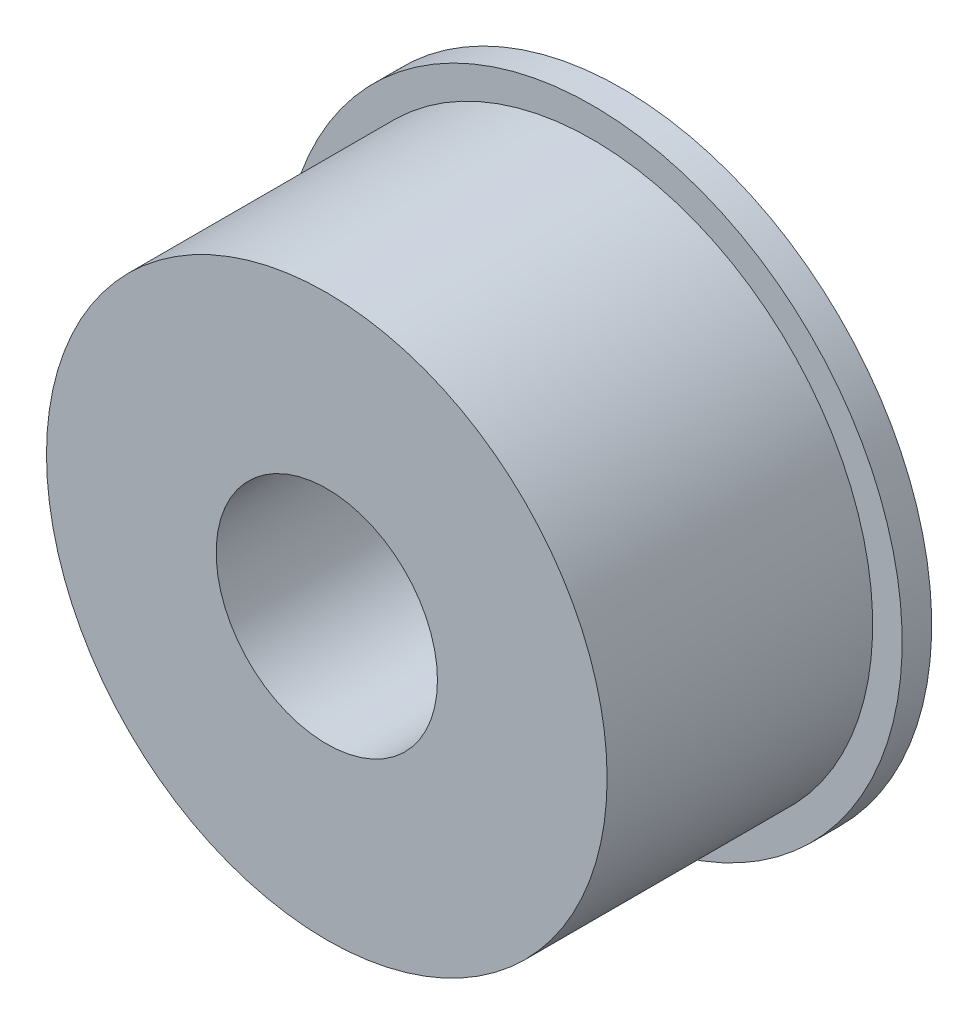
ISO-10303-21;
HEADER;
FILE_DESCRIPTION(('STEP AP214'),'2;1');
FILE_NAME('part.step','',(''),(''),'','','');
FILE_SCHEMA(('AUTOMOTIVE_DESIGN { 1 0 10303 214 1 1 1 1 }'));
ENDSEC;
DATA;
#1=APPLICATION_CONTEXT('core data for automotive mechanical design processes');
#2=APPLICATION_PROTOCOL_DEFINITION('international standard','automotive_design',2000,#1);
#3=PRODUCT_CONTEXT('',#1,'mechanical');
#4=PRODUCT('Part','Part','',(#3));
#5=PRODUCT_RELATED_PRODUCT_CATEGORY('part','',(#4));
#6=PRODUCT_DEFINITION_FORMATION('','',#4);
#7=PRODUCT_DEFINITION_CONTEXT('part definition',#1,'design');
#8=PRODUCT_DEFINITION('design','',#6,#7);
#9=PRODUCT_DEFINITION_SHAPE('','',#8);
#10=(LENGTH_UNIT() NAMED_UNIT(*) SI_UNIT(.MILLI.,.METRE.));
#11=(NAMED_UNIT(*) PLANE_ANGLE_UNIT() SI_UNIT($,.RADIAN.));
#12=(NAMED_UNIT(*) SI_UNIT($,.STERADIAN.) SOLID_ANGLE_UNIT());
#13=UNCERTAINTY_MEASURE_WITH_UNIT(LENGTH_MEASURE(1.E-05),#10,'distance_accuracy_value','');
#14=(GEOMETRIC_REPRESENTATION_CONTEXT(3) GLOBAL_UNCERTAINTY_ASSIGNED_CONTEXT((#13)) GLOBAL_UNIT_ASSIGNED_CONTEXT((#10,
#11,#12)) REPRESENTATION_CONTEXT('',''));
#15=CARTESIAN_POINT('',(0.,0.,0.));
#16=DIRECTION('',(0.,0.,1.));
#17=DIRECTION('',(1.,0.,0.));
#18=AXIS2_PLACEMENT_3D('',#15,#16,#17);
#19=CARTESIAN_POINT('',(0.,0.,20.));
#20=DIRECTION('',(0.,0.,-1.));
#21=DIRECTION('',(-1.,0.,0.));
#22=AXIS2_PLACEMENT_3D('',#19,#20,#21);
#23=CYLINDRICAL_SURFACE('',#22,19.);
#24=CARTESIAN_POINT('',(0.,0.,20.));
#25=DIRECTION('',(0.,0.,1.));
#26=DIRECTION('',(1.,0.,0.));
#27=AXIS2_PLACEMENT_3D('',#24,#25,#26);
#28=CIRCLE('',#27,19.);
#29=CARTESIAN_POINT('',(19.,0.,20.));
#30=VERTEX_POINT('',#29);
#31=EDGE_CURVE('E51',#30,#30,#28,.T.);
#32=ORIENTED_EDGE('',*,*,#31,.F.);
#33=EDGE_LOOP('',(#32));
#34=FACE_BOUND('',#33,.T.);
#35=CARTESIAN_POINT('',(0.,0.,2.));
#36=DIRECTION('',(0.,0.,-1.));
#37=DIRECTION('',(-1.,0.,0.));
#38=AXIS2_PLACEMENT_3D('',#35,#36,#37);
#39=CIRCLE('',#38,19.);
#40=CARTESIAN_POINT('',(-19.,0.,2.));
#41=VERTEX_POINT('',#40);
#42=EDGE_CURVE('E10',#41,#41,#39,.T.);
#43=ORIENTED_EDGE('',*,*,#42,.F.);
#44=EDGE_LOOP('',(#43));
#45=FACE_BOUND('',#44,.T.);
#46=ADVANCED_FACE('F44',(#34,#45),#23,.T.);
#47=CARTESIAN_POINT('',(0.,0.,20.));
#48=DIRECTION('',(0.,0.,1.));
#49=DIRECTION('',(1.,0.,0.));
#50=AXIS2_PLACEMENT_3D('',#47,#48,#49);
#51=PLANE('',#50);
#52=ORIENTED_EDGE('',*,*,#31,.T.);
#53=EDGE_LOOP('',(#52));
#54=FACE_BOUND('',#53,.T.);
#55=CARTESIAN_POINT('',(0.,0.,20.));
#56=DIRECTION('',(0.,0.,1.));
#57=DIRECTION('',(1.,0.,0.));
#58=AXIS2_PLACEMENT_3D('',#55,#56,#57);
#59=CIRCLE('',#58,7.5);
#60=CARTESIAN_POINT('',(7.5,0.,20.));
#61=VERTEX_POINT('',#60);
#62=EDGE_CURVE('E54',#61,#61,#59,.T.);
#63=ORIENTED_EDGE('',*,*,#62,.F.);
#64=EDGE_LOOP('',(#63));
#65=FACE_BOUND('',#64,.T.);
#66=ADVANCED_FACE('F83',(#54,#65),#51,.T.);
#67=CARTESIAN_POINT('',(0.,0.,0.));
#68=DIRECTION('',(0.,0.,1.));
#69=DIRECTION('',(1.,0.,0.));
#70=AXIS2_PLACEMENT_3D('',#67,#68,#69);
#71=PLANE('',#70);
#72=CARTESIAN_POINT('',(0.,0.,0.));
#73=DIRECTION('',(0.,0.,1.));
#74=DIRECTION('',(1.,0.,0.));
#75=AXIS2_PLACEMENT_3D('',#72,#73,#74);
#76=CIRCLE('',#75,7.5);
#77=CARTESIAN_POINT('',(7.5,0.,0.));
#78=VERTEX_POINT('',#77);
#79=EDGE_CURVE('E56',#78,#78,#76,.T.);
#80=ORIENTED_EDGE('',*,*,#79,.T.);
#81=EDGE_LOOP('',(#80));
#82=FACE_BOUND('',#81,.T.);
#83=CARTESIAN_POINT('',(0.,0.,0.));
#84=DIRECTION('',(0.,0.,-1.));
#85=DIRECTION('',(-1.,0.,0.));
#86=AXIS2_PLACEMENT_3D('',#83,#84,#85);
#87=CIRCLE('',#86,21.);
#88=CARTESIAN_POINT('',(-21.,0.,0.));
#89=VERTEX_POINT('',#88);
#90=EDGE_CURVE('E61',#89,#89,#87,.T.);
#91=ORIENTED_EDGE('',*,*,#90,.T.);
#92=EDGE_LOOP('',(#91));
#93=FACE_BOUND('',#92,.T.);
#94=ADVANCED_FACE('F89',(#82,#93),#71,.F.);
#95=CARTESIAN_POINT('',(0.,0.,20.));
#96=DIRECTION('',(0.,0.,-1.));
#97=DIRECTION('',(-1.,0.,0.));
#98=AXIS2_PLACEMENT_3D('',#95,#96,#97);
#99=CYLINDRICAL_SURFACE('',#98,7.5);
#100=ORIENTED_EDGE('',*,*,#62,.T.);
#101=EDGE_LOOP('',(#100));
#102=FACE_BOUND('',#101,.T.);
#103=ORIENTED_EDGE('',*,*,#79,.F.);
#104=EDGE_LOOP('',(#103));
#105=FACE_BOUND('',#104,.T.);
#106=ADVANCED_FACE('F76',(#102,#105),#99,.F.);
#107=CARTESIAN_POINT('',(0.,0.,2.));
#108=DIRECTION('',(0.,0.,-1.));
#109=DIRECTION('',(-1.,0.,0.));
#110=AXIS2_PLACEMENT_3D('',#107,#108,#109);
#111=CYLINDRICAL_SURFACE('',#110,21.);
#112=CARTESIAN_POINT('',(0.,0.,2.));
#113=DIRECTION('',(0.,0.,-1.));
#114=DIRECTION('',(-1.,0.,0.));
#115=AXIS2_PLACEMENT_3D('',#112,#113,#114);
#116=CIRCLE('',#115,21.);
#117=CARTESIAN_POINT('',(-21.,0.,2.));
#118=VERTEX_POINT('',#117);
#119=EDGE_CURVE('E62',#118,#118,#116,.T.);
#120=ORIENTED_EDGE('',*,*,#119,.T.);
#121=EDGE_LOOP('',(#120));
#122=FACE_BOUND('',#121,.T.);
#123=ORIENTED_EDGE('',*,*,#90,.F.);
#124=EDGE_LOOP('',(#123));
#125=FACE_BOUND('',#124,.T.);
#126=ADVANCED_FACE('F72',(#122,#125),#111,.T.);
#127=CARTESIAN_POINT('',(0.,0.,2.));
#128=DIRECTION('',(0.,0.,-1.));
#129=DIRECTION('',(-1.,0.,0.));
#130=AXIS2_PLACEMENT_3D('',#127,#128,#129);
#131=PLANE('',#130);
#132=ORIENTED_EDGE('',*,*,#42,.T.);
#133=EDGE_LOOP('',(#132));
#134=FACE_BOUND('',#133,.T.);
#135=ORIENTED_EDGE('',*,*,#119,.F.);
#136=EDGE_LOOP('',(#135));
#137=FACE_BOUND('',#136,.T.);
#138=ADVANCED_FACE('F74',(#134,#137),#131,.F.);
#139=CLOSED_SHELL('',(#46,#66,#94,#106,#126,#138));
#140=MANIFOLD_SOLID_BREP('B2',#139);
#141=ADVANCED_BREP_SHAPE_REPRESENTATION('',(#18,#140),#14);
#142=SHAPE_DEFINITION_REPRESENTATION(#9,#141);
ENDSEC;
END-ISO-10303-21;
